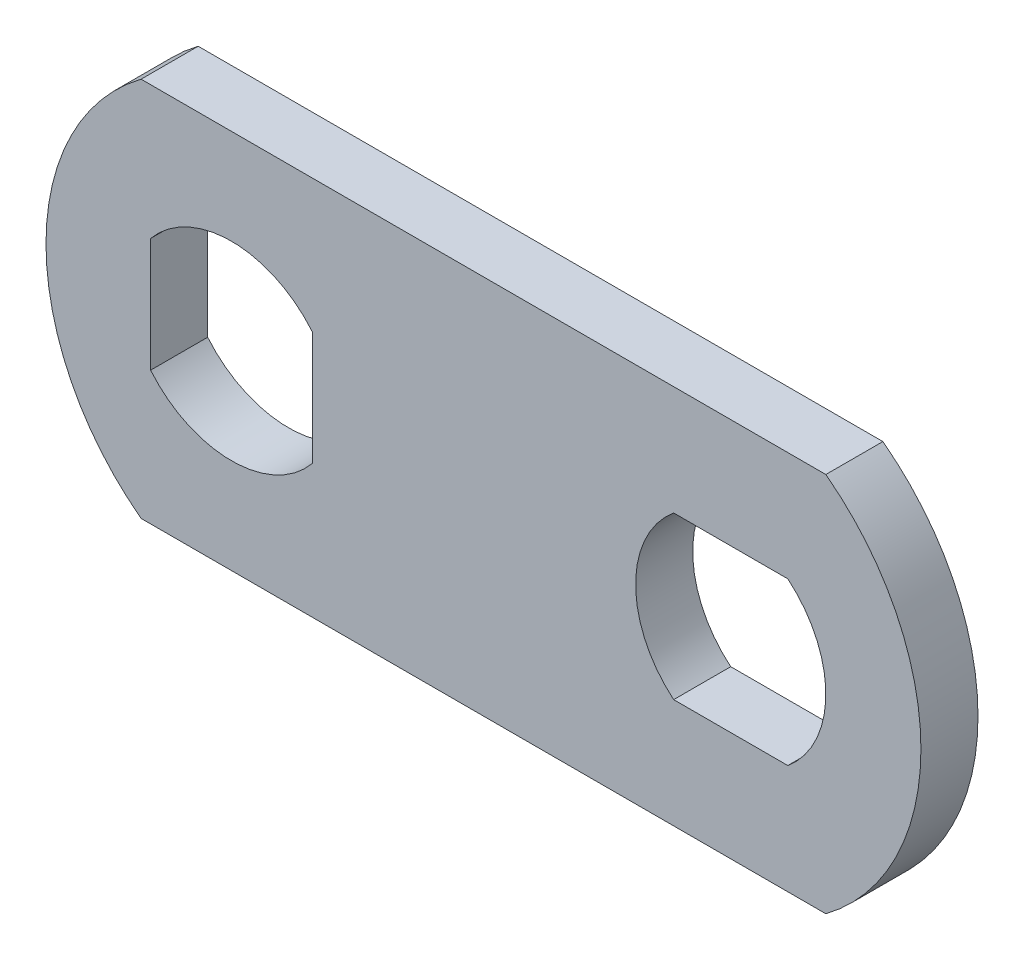
ISO-10303-21;
HEADER;
FILE_DESCRIPTION(('STEP AP214'),'2;1');
FILE_NAME('part.step','',(''),(''),'','','');
FILE_SCHEMA(('AUTOMOTIVE_DESIGN { 1 0 10303 214 1 1 1 1 }'));
ENDSEC;
DATA;
#1=APPLICATION_CONTEXT('core data for automotive mechanical design processes');
#2=APPLICATION_PROTOCOL_DEFINITION('international standard','automotive_design',2000,#1);
#3=PRODUCT_CONTEXT('',#1,'mechanical');
#4=PRODUCT('Part','Part','',(#3));
#5=PRODUCT_RELATED_PRODUCT_CATEGORY('part','',(#4));
#6=PRODUCT_DEFINITION_FORMATION('','',#4);
#7=PRODUCT_DEFINITION_CONTEXT('part definition',#1,'design');
#8=PRODUCT_DEFINITION('design','',#6,#7);
#9=PRODUCT_DEFINITION_SHAPE('','',#8);
#10=(LENGTH_UNIT() NAMED_UNIT(*) SI_UNIT(.MILLI.,.METRE.));
#11=(NAMED_UNIT(*) PLANE_ANGLE_UNIT() SI_UNIT($,.RADIAN.));
#12=(NAMED_UNIT(*) SI_UNIT($,.STERADIAN.) SOLID_ANGLE_UNIT());
#13=UNCERTAINTY_MEASURE_WITH_UNIT(LENGTH_MEASURE(1.E-05),#10,'distance_accuracy_value','');
#14=(GEOMETRIC_REPRESENTATION_CONTEXT(3) GLOBAL_UNCERTAINTY_ASSIGNED_CONTEXT((#13)) GLOBAL_UNIT_ASSIGNED_CONTEXT((#10,
#11,#12)) REPRESENTATION_CONTEXT('',''));
#15=CARTESIAN_POINT('',(0.,0.,0.));
#16=DIRECTION('',(0.,0.,1.));
#17=DIRECTION('',(1.,0.,0.));
#18=AXIS2_PLACEMENT_3D('',#15,#16,#17);
#19=CARTESIAN_POINT('',(33.5,0.,-3.));
#20=DIRECTION('',(0.,0.,1.));
#21=DIRECTION('',(1.,0.,0.));
#22=AXIS2_PLACEMENT_3D('',#19,#20,#21);
#23=CYLINDRICAL_SURFACE('',#22,12.5);
#24=CARTESIAN_POINT('',(33.5,0.,0.));
#25=DIRECTION('',(0.,0.,1.));
#26=DIRECTION('',(-1.,0.,0.));
#27=AXIS2_PLACEMENT_3D('',#24,#25,#26);
#28=CIRCLE('',#27,12.5);
#29=CARTESIAN_POINT('',(41.,-10.,0.));
#30=VERTEX_POINT('',#29);
#31=CARTESIAN_POINT('',(41.,10.,0.));
#32=VERTEX_POINT('',#31);
#33=EDGE_CURVE('E191',#30,#32,#28,.T.);
#34=ORIENTED_EDGE('',*,*,#33,.F.);
#35=DIRECTION('',(0.,0.,1.));
#36=VECTOR('',#35,1.);
#37=CARTESIAN_POINT('',(41.,-10.,-3.));
#38=LINE('',#37,#36);
#39=CARTESIAN_POINT('',(41.,-10.,-3.));
#40=VERTEX_POINT('',#39);
#41=EDGE_CURVE('E11',#40,#30,#38,.T.);
#42=ORIENTED_EDGE('',*,*,#41,.F.);
#43=CARTESIAN_POINT('',(33.5,0.,-3.));
#44=DIRECTION('',(0.,0.,1.));
#45=DIRECTION('',(-1.,0.,0.));
#46=AXIS2_PLACEMENT_3D('',#43,#44,#45);
#47=CIRCLE('',#46,12.5);
#48=CARTESIAN_POINT('',(41.,10.,-3.));
#49=VERTEX_POINT('',#48);
#50=EDGE_CURVE('E192',#40,#49,#47,.T.);
#51=ORIENTED_EDGE('',*,*,#50,.T.);
#52=DIRECTION('',(0.,0.,1.));
#53=VECTOR('',#52,1.);
#54=CARTESIAN_POINT('',(41.,10.,-3.));
#55=LINE('',#54,#53);
#56=EDGE_CURVE('E41',#49,#32,#55,.T.);
#57=ORIENTED_EDGE('',*,*,#56,.T.);
#58=EDGE_LOOP('',(#34,#42,#51,#57));
#59=FACE_BOUND('',#58,.T.);
#60=ADVANCED_FACE('F38',(#59),#23,.T.);
#61=CARTESIAN_POINT('',(41.,-10.,-3.));
#62=DIRECTION('',(0.,-1.,0.));
#63=DIRECTION('',(0.,0.,-1.));
#64=AXIS2_PLACEMENT_3D('',#61,#62,#63);
#65=PLANE('',#64);
#66=DIRECTION('',(1.,0.,0.));
#67=VECTOR('',#66,1.);
#68=CARTESIAN_POINT('',(41.,-10.,0.));
#69=LINE('',#68,#67);
#70=CARTESIAN_POINT('',(5.,-10.,0.));
#71=VERTEX_POINT('',#70);
#72=EDGE_CURVE('E196',#71,#30,#69,.T.);
#73=ORIENTED_EDGE('',*,*,#72,.F.);
#74=DIRECTION('',(0.,0.,1.));
#75=VECTOR('',#74,1.);
#76=CARTESIAN_POINT('',(5.,-10.,-3.));
#77=LINE('',#76,#75);
#78=CARTESIAN_POINT('',(5.,-10.,-3.));
#79=VERTEX_POINT('',#78);
#80=EDGE_CURVE('E46',#79,#71,#77,.T.);
#81=ORIENTED_EDGE('',*,*,#80,.F.);
#82=DIRECTION('',(1.,0.,0.));
#83=VECTOR('',#82,1.);
#84=CARTESIAN_POINT('',(41.,-10.,-3.));
#85=LINE('',#84,#83);
#86=EDGE_CURVE('E202',#79,#40,#85,.T.);
#87=ORIENTED_EDGE('',*,*,#86,.T.);
#88=ORIENTED_EDGE('',*,*,#41,.T.);
#89=EDGE_LOOP('',(#73,#81,#87,#88));
#90=FACE_BOUND('',#89,.T.);
#91=ADVANCED_FACE('F227',(#90),#65,.T.);
#92=CARTESIAN_POINT('',(12.5,0.,-3.));
#93=DIRECTION('',(0.,0.,1.));
#94=DIRECTION('',(1.,0.,0.));
#95=AXIS2_PLACEMENT_3D('',#92,#93,#94);
#96=CYLINDRICAL_SURFACE('',#95,12.5);
#97=CARTESIAN_POINT('',(12.5,0.,0.));
#98=DIRECTION('',(0.,0.,1.));
#99=DIRECTION('',(1.,0.,0.));
#100=AXIS2_PLACEMENT_3D('',#97,#98,#99);
#101=CIRCLE('',#100,12.5);
#102=CARTESIAN_POINT('',(4.99999999999999,10.,0.));
#103=VERTEX_POINT('',#102);
#104=EDGE_CURVE('E210',#103,#71,#101,.T.);
#105=ORIENTED_EDGE('',*,*,#104,.F.);
#106=DIRECTION('',(0.,0.,1.));
#107=VECTOR('',#106,1.);
#108=CARTESIAN_POINT('',(4.99999999999999,10.,-3.));
#109=LINE('',#108,#107);
#110=CARTESIAN_POINT('',(4.99999999999999,10.,-3.));
#111=VERTEX_POINT('',#110);
#112=EDGE_CURVE('E215',#111,#103,#109,.T.);
#113=ORIENTED_EDGE('',*,*,#112,.F.);
#114=CARTESIAN_POINT('',(12.5,0.,-3.));
#115=DIRECTION('',(0.,0.,1.));
#116=DIRECTION('',(1.,0.,0.));
#117=AXIS2_PLACEMENT_3D('',#114,#115,#116);
#118=CIRCLE('',#117,12.5);
#119=EDGE_CURVE('E199',#111,#79,#118,.T.);
#120=ORIENTED_EDGE('',*,*,#119,.T.);
#121=ORIENTED_EDGE('',*,*,#80,.T.);
#122=EDGE_LOOP('',(#105,#113,#120,#121));
#123=FACE_BOUND('',#122,.T.);
#124=ADVANCED_FACE('F233',(#123),#96,.T.);
#125=CARTESIAN_POINT('',(5.,10.,-3.));
#126=DIRECTION('',(0.,1.,0.));
#127=DIRECTION('',(0.,0.,1.));
#128=AXIS2_PLACEMENT_3D('',#125,#126,#127);
#129=PLANE('',#128);
#130=DIRECTION('',(-1.,0.,0.));
#131=VECTOR('',#130,1.);
#132=CARTESIAN_POINT('',(5.,10.,0.));
#133=LINE('',#132,#131);
#134=EDGE_CURVE('E207',#32,#103,#133,.T.);
#135=ORIENTED_EDGE('',*,*,#134,.F.);
#136=ORIENTED_EDGE('',*,*,#56,.F.);
#137=DIRECTION('',(-1.,0.,0.));
#138=VECTOR('',#137,1.);
#139=CARTESIAN_POINT('',(5.,10.,-3.));
#140=LINE('',#139,#138);
#141=EDGE_CURVE('E195',#49,#111,#140,.T.);
#142=ORIENTED_EDGE('',*,*,#141,.T.);
#143=ORIENTED_EDGE('',*,*,#112,.T.);
#144=EDGE_LOOP('',(#135,#136,#142,#143));
#145=FACE_BOUND('',#144,.T.);
#146=ADVANCED_FACE('F223',(#145),#129,.T.);
#147=CARTESIAN_POINT('',(33.5,0.,-3.));
#148=DIRECTION('',(0.,0.,-1.));
#149=DIRECTION('',(-1.,0.,0.));
#150=AXIS2_PLACEMENT_3D('',#147,#148,#149);
#151=PLANE('',#150);
#152=CARTESIAN_POINT('',(35.484375,0.,-3.));
#153=DIRECTION('',(0.,0.,-1.));
#154=DIRECTION('',(-1.,0.,0.));
#155=AXIS2_PLACEMENT_3D('',#152,#153,#154);
#156=CIRCLE('',#155,5.51562499999999);
#157=CARTESIAN_POINT('',(39.,4.24999999999999,-3.));
#158=VERTEX_POINT('',#157);
#159=CARTESIAN_POINT('',(39.,-4.25000000000001,-3.));
#160=VERTEX_POINT('',#159);
#161=EDGE_CURVE('E160',#158,#160,#156,.T.);
#162=ORIENTED_EDGE('',*,*,#161,.F.);
#163=DIRECTION('',(1.,0.,0.));
#164=VECTOR('',#163,1.);
#165=CARTESIAN_POINT('',(33.5,4.25000000000001,-3.));
#166=LINE('',#165,#164);
#167=CARTESIAN_POINT('',(33.,4.25000000000001,-3.));
#168=VERTEX_POINT('',#167);
#169=EDGE_CURVE('E153',#168,#158,#166,.T.);
#170=ORIENTED_EDGE('',*,*,#169,.F.);
#171=CARTESIAN_POINT('',(36.515625,0.,-3.));
#172=DIRECTION('',(0.,0.,-1.));
#173=DIRECTION('',(-1.,0.,0.));
#174=AXIS2_PLACEMENT_3D('',#171,#172,#173);
#175=CIRCLE('',#174,5.51562499999999);
#176=CARTESIAN_POINT('',(33.,-4.24999999999999,-3.));
#177=VERTEX_POINT('',#176);
#178=EDGE_CURVE('E133',#177,#168,#175,.T.);
#179=ORIENTED_EDGE('',*,*,#178,.F.);
#180=DIRECTION('',(-1.,0.,0.));
#181=VECTOR('',#180,1.);
#182=CARTESIAN_POINT('',(33.5,-4.24999999999999,-3.));
#183=LINE('',#182,#181);
#184=EDGE_CURVE('E158',#160,#177,#183,.T.);
#185=ORIENTED_EDGE('',*,*,#184,.F.);
#186=EDGE_LOOP('',(#162,#170,#179,#185));
#187=FACE_BOUND('',#186,.T.);
#188=CARTESIAN_POINT('',(9.75,-0.515625000000004,-3.));
#189=DIRECTION('',(0.,0.,-1.));
#190=DIRECTION('',(-1.,0.,0.));
#191=AXIS2_PLACEMENT_3D('',#188,#189,#190);
#192=CIRCLE('',#191,5.515625);
#193=CARTESIAN_POINT('',(5.5,3.,-3.));
#194=VERTEX_POINT('',#193);
#195=CARTESIAN_POINT('',(14.,3.,-3.));
#196=VERTEX_POINT('',#195);
#197=EDGE_CURVE('E189',#194,#196,#192,.T.);
#198=ORIENTED_EDGE('',*,*,#197,.F.);
#199=DIRECTION('',(0.,1.,0.));
#200=VECTOR('',#199,1.);
#201=CARTESIAN_POINT('',(5.5,0.,-3.));
#202=LINE('',#201,#200);
#203=CARTESIAN_POINT('',(5.5,-3.,-3.));
#204=VERTEX_POINT('',#203);
#205=EDGE_CURVE('E176',#204,#194,#202,.T.);
#206=ORIENTED_EDGE('',*,*,#205,.F.);
#207=CARTESIAN_POINT('',(9.75,0.515625000000004,-3.));
#208=DIRECTION('',(0.,0.,-1.));
#209=DIRECTION('',(-1.,0.,0.));
#210=AXIS2_PLACEMENT_3D('',#207,#208,#209);
#211=CIRCLE('',#210,5.515625);
#212=CARTESIAN_POINT('',(14.,-3.,-3.));
#213=VERTEX_POINT('',#212);
#214=EDGE_CURVE('E184',#213,#204,#211,.T.);
#215=ORIENTED_EDGE('',*,*,#214,.F.);
#216=DIRECTION('',(0.,-1.,0.));
#217=VECTOR('',#216,1.);
#218=CARTESIAN_POINT('',(14.,0.,-3.));
#219=LINE('',#218,#217);
#220=EDGE_CURVE('E187',#196,#213,#219,.T.);
#221=ORIENTED_EDGE('',*,*,#220,.F.);
#222=EDGE_LOOP('',(#198,#206,#215,#221));
#223=FACE_BOUND('',#222,.T.);
#224=ORIENTED_EDGE('',*,*,#50,.F.);
#225=ORIENTED_EDGE('',*,*,#86,.F.);
#226=ORIENTED_EDGE('',*,*,#119,.F.);
#227=ORIENTED_EDGE('',*,*,#141,.F.);
#228=EDGE_LOOP('',(#224,#225,#226,#227));
#229=FACE_BOUND('',#228,.T.);
#230=ADVANCED_FACE('F230',(#187,#223,#229),#151,.T.);
#231=CARTESIAN_POINT('',(33.5,0.,0.));
#232=DIRECTION('',(0.,0.,-1.));
#233=DIRECTION('',(-1.,0.,0.));
#234=AXIS2_PLACEMENT_3D('',#231,#232,#233);
#235=PLANE('',#234);
#236=DIRECTION('',(-1.,0.,0.));
#237=VECTOR('',#236,1.);
#238=CARTESIAN_POINT('',(39.,4.24999999999999,0.));
#239=LINE('',#238,#237);
#240=CARTESIAN_POINT('',(39.,4.24999999999999,0.));
#241=VERTEX_POINT('',#240);
#242=CARTESIAN_POINT('',(33.,4.25000000000001,0.));
#243=VERTEX_POINT('',#242);
#244=EDGE_CURVE('E139',#241,#243,#239,.T.);
#245=ORIENTED_EDGE('',*,*,#244,.F.);
#246=CARTESIAN_POINT('',(35.484375,0.,0.));
#247=DIRECTION('',(0.,0.,1.));
#248=DIRECTION('',(-1.,0.,0.));
#249=AXIS2_PLACEMENT_3D('',#246,#247,#248);
#250=CIRCLE('',#249,5.51562499999999);
#251=CARTESIAN_POINT('',(39.,-4.25000000000001,0.));
#252=VERTEX_POINT('',#251);
#253=EDGE_CURVE('E62',#252,#241,#250,.T.);
#254=ORIENTED_EDGE('',*,*,#253,.F.);
#255=DIRECTION('',(1.,0.,0.));
#256=VECTOR('',#255,1.);
#257=CARTESIAN_POINT('',(39.,-4.25000000000001,0.));
#258=LINE('',#257,#256);
#259=CARTESIAN_POINT('',(33.,-4.24999999999999,0.));
#260=VERTEX_POINT('',#259);
#261=EDGE_CURVE('E146',#260,#252,#258,.T.);
#262=ORIENTED_EDGE('',*,*,#261,.F.);
#263=CARTESIAN_POINT('',(36.515625,0.,0.));
#264=DIRECTION('',(0.,0.,1.));
#265=DIRECTION('',(1.,0.,0.));
#266=AXIS2_PLACEMENT_3D('',#263,#264,#265);
#267=CIRCLE('',#266,5.51562499999999);
#268=EDGE_CURVE('E130',#243,#260,#267,.T.);
#269=ORIENTED_EDGE('',*,*,#268,.F.);
#270=EDGE_LOOP('',(#245,#254,#262,#269));
#271=FACE_BOUND('',#270,.T.);
#272=DIRECTION('',(0.,-1.,0.));
#273=VECTOR('',#272,1.);
#274=CARTESIAN_POINT('',(5.5,3.,0.));
#275=LINE('',#274,#273);
#276=CARTESIAN_POINT('',(5.5,3.,0.));
#277=VERTEX_POINT('',#276);
#278=CARTESIAN_POINT('',(5.5,-3.,0.));
#279=VERTEX_POINT('',#278);
#280=EDGE_CURVE('E164',#277,#279,#275,.T.);
#281=ORIENTED_EDGE('',*,*,#280,.F.);
#282=CARTESIAN_POINT('',(9.75,-0.515625000000004,0.));
#283=DIRECTION('',(0.,0.,1.));
#284=DIRECTION('',(-1.,0.,0.));
#285=AXIS2_PLACEMENT_3D('',#282,#283,#284);
#286=CIRCLE('',#285,5.515625);
#287=CARTESIAN_POINT('',(14.,3.,0.));
#288=VERTEX_POINT('',#287);
#289=EDGE_CURVE('E162',#288,#277,#286,.T.);
#290=ORIENTED_EDGE('',*,*,#289,.F.);
#291=DIRECTION('',(0.,1.,0.));
#292=VECTOR('',#291,1.);
#293=CARTESIAN_POINT('',(14.,3.,0.));
#294=LINE('',#293,#292);
#295=CARTESIAN_POINT('',(14.,-3.,0.));
#296=VERTEX_POINT('',#295);
#297=EDGE_CURVE('E170',#296,#288,#294,.T.);
#298=ORIENTED_EDGE('',*,*,#297,.F.);
#299=CARTESIAN_POINT('',(9.75,0.515625000000004,0.));
#300=DIRECTION('',(0.,0.,1.));
#301=DIRECTION('',(1.,0.,0.));
#302=AXIS2_PLACEMENT_3D('',#299,#300,#301);
#303=CIRCLE('',#302,5.515625);
#304=EDGE_CURVE('E167',#279,#296,#303,.T.);
#305=ORIENTED_EDGE('',*,*,#304,.F.);
#306=EDGE_LOOP('',(#281,#290,#298,#305));
#307=FACE_BOUND('',#306,.T.);
#308=ORIENTED_EDGE('',*,*,#33,.T.);
#309=ORIENTED_EDGE('',*,*,#134,.T.);
#310=ORIENTED_EDGE('',*,*,#104,.T.);
#311=ORIENTED_EDGE('',*,*,#72,.T.);
#312=EDGE_LOOP('',(#308,#309,#310,#311));
#313=FACE_BOUND('',#312,.T.);
#314=ADVANCED_FACE('F143',(#271,#307,#313),#235,.F.);
#315=CARTESIAN_POINT('',(9.75,-0.515625000000004,-10.));
#316=DIRECTION('',(0.,0.,1.));
#317=DIRECTION('',(1.,0.,0.));
#318=AXIS2_PLACEMENT_3D('',#315,#316,#317);
#319=CYLINDRICAL_SURFACE('',#318,5.515625);
#320=ORIENTED_EDGE('',*,*,#197,.T.);
#321=DIRECTION('',(0.,0.,1.));
#322=VECTOR('',#321,1.);
#323=CARTESIAN_POINT('',(14.,3.,-10.));
#324=LINE('',#323,#322);
#325=EDGE_CURVE('E174',#196,#288,#324,.T.);
#326=ORIENTED_EDGE('',*,*,#325,.T.);
#327=ORIENTED_EDGE('',*,*,#289,.T.);
#328=DIRECTION('',(0.,0.,1.));
#329=VECTOR('',#328,1.);
#330=CARTESIAN_POINT('',(5.5,3.,-10.));
#331=LINE('',#330,#329);
#332=EDGE_CURVE('E173',#194,#277,#331,.T.);
#333=ORIENTED_EDGE('',*,*,#332,.F.);
#334=EDGE_LOOP('',(#320,#326,#327,#333));
#335=FACE_BOUND('',#334,.T.);
#336=ADVANCED_FACE('F281',(#335),#319,.F.);
#337=CARTESIAN_POINT('',(14.,3.,-10.));
#338=DIRECTION('',(1.,0.,0.));
#339=DIRECTION('',(0.,0.,-1.));
#340=AXIS2_PLACEMENT_3D('',#337,#338,#339);
#341=PLANE('',#340);
#342=ORIENTED_EDGE('',*,*,#220,.T.);
#343=DIRECTION('',(0.,0.,1.));
#344=VECTOR('',#343,1.);
#345=CARTESIAN_POINT('',(14.,-3.,-10.));
#346=LINE('',#345,#344);
#347=EDGE_CURVE('E177',#213,#296,#346,.T.);
#348=ORIENTED_EDGE('',*,*,#347,.T.);
#349=ORIENTED_EDGE('',*,*,#297,.T.);
#350=ORIENTED_EDGE('',*,*,#325,.F.);
#351=EDGE_LOOP('',(#342,#348,#349,#350));
#352=FACE_BOUND('',#351,.T.);
#353=ADVANCED_FACE('F290',(#352),#341,.F.);
#354=CARTESIAN_POINT('',(9.75,0.515625000000004,-10.));
#355=DIRECTION('',(0.,0.,1.));
#356=DIRECTION('',(1.,0.,0.));
#357=AXIS2_PLACEMENT_3D('',#354,#355,#356);
#358=CYLINDRICAL_SURFACE('',#357,5.515625);
#359=ORIENTED_EDGE('',*,*,#214,.T.);
#360=DIRECTION('',(0.,0.,1.));
#361=VECTOR('',#360,1.);
#362=CARTESIAN_POINT('',(5.5,-3.,-10.));
#363=LINE('',#362,#361);
#364=EDGE_CURVE('E179',#204,#279,#363,.T.);
#365=ORIENTED_EDGE('',*,*,#364,.T.);
#366=ORIENTED_EDGE('',*,*,#304,.T.);
#367=ORIENTED_EDGE('',*,*,#347,.F.);
#368=EDGE_LOOP('',(#359,#365,#366,#367));
#369=FACE_BOUND('',#368,.T.);
#370=ADVANCED_FACE('F301',(#369),#358,.F.);
#371=CARTESIAN_POINT('',(5.5,3.,-10.));
#372=DIRECTION('',(-1.,0.,0.));
#373=DIRECTION('',(0.,0.,1.));
#374=AXIS2_PLACEMENT_3D('',#371,#372,#373);
#375=PLANE('',#374);
#376=ORIENTED_EDGE('',*,*,#205,.T.);
#377=ORIENTED_EDGE('',*,*,#332,.T.);
#378=ORIENTED_EDGE('',*,*,#280,.T.);
#379=ORIENTED_EDGE('',*,*,#364,.F.);
#380=EDGE_LOOP('',(#376,#377,#378,#379));
#381=FACE_BOUND('',#380,.T.);
#382=ADVANCED_FACE('F312',(#381),#375,.F.);
#383=CARTESIAN_POINT('',(35.484375,0.,-10.));
#384=DIRECTION('',(0.,0.,1.));
#385=DIRECTION('',(1.,0.,0.));
#386=AXIS2_PLACEMENT_3D('',#383,#384,#385);
#387=CYLINDRICAL_SURFACE('',#386,5.51562499999999);
#388=ORIENTED_EDGE('',*,*,#161,.T.);
#389=DIRECTION('',(0.,0.,1.));
#390=VECTOR('',#389,1.);
#391=CARTESIAN_POINT('',(39.,-4.25000000000001,-10.));
#392=LINE('',#391,#390);
#393=EDGE_CURVE('E151',#160,#252,#392,.T.);
#394=ORIENTED_EDGE('',*,*,#393,.T.);
#395=ORIENTED_EDGE('',*,*,#253,.T.);
#396=DIRECTION('',(0.,0.,1.));
#397=VECTOR('',#396,1.);
#398=CARTESIAN_POINT('',(39.,4.24999999999999,-10.));
#399=LINE('',#398,#397);
#400=EDGE_CURVE('E136',#158,#241,#399,.T.);
#401=ORIENTED_EDGE('',*,*,#400,.F.);
#402=EDGE_LOOP('',(#388,#394,#395,#401));
#403=FACE_BOUND('',#402,.T.);
#404=ADVANCED_FACE('F323',(#403),#387,.F.);
#405=CARTESIAN_POINT('',(39.,-4.25000000000001,-10.));
#406=DIRECTION('',(0.,-1.,0.));
#407=DIRECTION('',(1.,0.,0.));
#408=AXIS2_PLACEMENT_3D('',#405,#406,#407);
#409=PLANE('',#408);
#410=ORIENTED_EDGE('',*,*,#184,.T.);
#411=DIRECTION('',(0.,0.,1.));
#412=VECTOR('',#411,1.);
#413=CARTESIAN_POINT('',(33.,-4.24999999999999,-10.));
#414=LINE('',#413,#412);
#415=EDGE_CURVE('E135',#177,#260,#414,.T.);
#416=ORIENTED_EDGE('',*,*,#415,.T.);
#417=ORIENTED_EDGE('',*,*,#261,.T.);
#418=ORIENTED_EDGE('',*,*,#393,.F.);
#419=EDGE_LOOP('',(#410,#416,#417,#418));
#420=FACE_BOUND('',#419,.T.);
#421=ADVANCED_FACE('F334',(#420),#409,.F.);
#422=CARTESIAN_POINT('',(36.515625,0.,-10.));
#423=DIRECTION('',(0.,0.,1.));
#424=DIRECTION('',(1.,0.,0.));
#425=AXIS2_PLACEMENT_3D('',#422,#423,#424);
#426=CYLINDRICAL_SURFACE('',#425,5.51562499999999);
#427=ORIENTED_EDGE('',*,*,#178,.T.);
#428=DIRECTION('',(0.,0.,1.));
#429=VECTOR('',#428,1.);
#430=CARTESIAN_POINT('',(33.,4.25000000000001,-10.));
#431=LINE('',#430,#429);
#432=EDGE_CURVE('E54',#168,#243,#431,.T.);
#433=ORIENTED_EDGE('',*,*,#432,.T.);
#434=ORIENTED_EDGE('',*,*,#268,.T.);
#435=ORIENTED_EDGE('',*,*,#415,.F.);
#436=EDGE_LOOP('',(#427,#433,#434,#435));
#437=FACE_BOUND('',#436,.T.);
#438=ADVANCED_FACE('F127',(#437),#426,.F.);
#439=CARTESIAN_POINT('',(39.,4.24999999999999,-10.));
#440=DIRECTION('',(0.,1.,0.));
#441=DIRECTION('',(-1.,0.,0.));
#442=AXIS2_PLACEMENT_3D('',#439,#440,#441);
#443=PLANE('',#442);
#444=ORIENTED_EDGE('',*,*,#169,.T.);
#445=ORIENTED_EDGE('',*,*,#400,.T.);
#446=ORIENTED_EDGE('',*,*,#244,.T.);
#447=ORIENTED_EDGE('',*,*,#432,.F.);
#448=EDGE_LOOP('',(#444,#445,#446,#447));
#449=FACE_BOUND('',#448,.T.);
#450=ADVANCED_FACE('F140',(#449),#443,.F.);
#451=CLOSED_SHELL('',(#60,#91,#124,#146,#230,#314,#336,#353,#370,#382,#404,#421,#438,#450));
#452=MANIFOLD_SOLID_BREP('B2',#451);
#453=ADVANCED_BREP_SHAPE_REPRESENTATION('',(#18,#452),#14);
#454=SHAPE_DEFINITION_REPRESENTATION(#9,#453);
ENDSEC;
END-ISO-10303-21;
